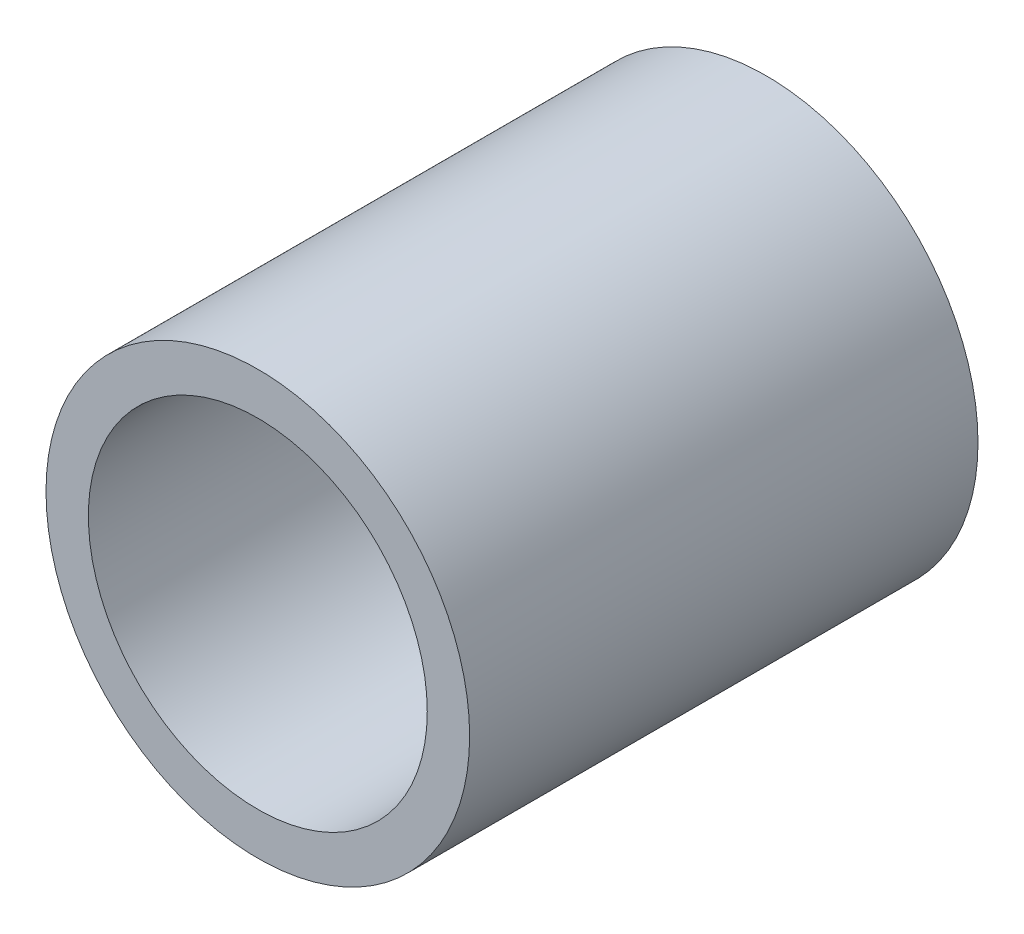
ISO-10303-21;
HEADER;
FILE_DESCRIPTION(('STEP AP214'),'2;1');
FILE_NAME('part.step','',(''),(''),'','','');
FILE_SCHEMA(('AUTOMOTIVE_DESIGN { 1 0 10303 214 1 1 1 1 }'));
ENDSEC;
DATA;
#1=APPLICATION_CONTEXT('core data for automotive mechanical design processes');
#2=APPLICATION_PROTOCOL_DEFINITION('international standard','automotive_design',2000,#1);
#3=PRODUCT_CONTEXT('',#1,'mechanical');
#4=PRODUCT('Part','Part','',(#3));
#5=PRODUCT_RELATED_PRODUCT_CATEGORY('part','',(#4));
#6=PRODUCT_DEFINITION_FORMATION('','',#4);
#7=PRODUCT_DEFINITION_CONTEXT('part definition',#1,'design');
#8=PRODUCT_DEFINITION('design','',#6,#7);
#9=PRODUCT_DEFINITION_SHAPE('','',#8);
#10=(LENGTH_UNIT() NAMED_UNIT(*) SI_UNIT(.MILLI.,.METRE.));
#11=(NAMED_UNIT(*) PLANE_ANGLE_UNIT() SI_UNIT($,.RADIAN.));
#12=(NAMED_UNIT(*) SI_UNIT($,.STERADIAN.) SOLID_ANGLE_UNIT());
#13=UNCERTAINTY_MEASURE_WITH_UNIT(LENGTH_MEASURE(1.E-05),#10,'distance_accuracy_value','');
#14=(GEOMETRIC_REPRESENTATION_CONTEXT(3) GLOBAL_UNCERTAINTY_ASSIGNED_CONTEXT((#13)) GLOBAL_UNIT_ASSIGNED_CONTEXT((#10,
#11,#12)) REPRESENTATION_CONTEXT('',''));
#15=CARTESIAN_POINT('',(0.,0.,0.));
#16=DIRECTION('',(0.,0.,1.));
#17=DIRECTION('',(1.,0.,0.));
#18=AXIS2_PLACEMENT_3D('',#15,#16,#17);
#19=CARTESIAN_POINT('',(0.,0.,0.));
#20=DIRECTION('',(0.,0.,-1.));
#21=DIRECTION('',(-1.,0.,0.));
#22=AXIS2_PLACEMENT_3D('',#19,#20,#21);
#23=PLANE('',#22);
#24=CARTESIAN_POINT('',(0.,0.,0.));
#25=DIRECTION('',(0.,0.,1.));
#26=DIRECTION('',(1.,0.,0.));
#27=AXIS2_PLACEMENT_3D('',#24,#25,#26);
#28=CIRCLE('',#27,6.35);
#29=CARTESIAN_POINT('',(6.35,0.,0.));
#30=VERTEX_POINT('',#29);
#31=EDGE_CURVE('E46',#30,#30,#28,.T.);
#32=ORIENTED_EDGE('',*,*,#31,.F.);
#33=EDGE_LOOP('',(#32));
#34=FACE_BOUND('',#33,.T.);
#35=CARTESIAN_POINT('',(0.,0.,0.));
#36=DIRECTION('',(0.,0.,1.));
#37=DIRECTION('',(1.,0.,0.));
#38=AXIS2_PLACEMENT_3D('',#35,#36,#37);
#39=CIRCLE('',#38,7.9375);
#40=CARTESIAN_POINT('',(7.9375,0.,0.));
#41=VERTEX_POINT('',#40);
#42=EDGE_CURVE('E10',#41,#41,#39,.T.);
#43=ORIENTED_EDGE('',*,*,#42,.T.);
#44=EDGE_LOOP('',(#43));
#45=FACE_BOUND('',#44,.T.);
#46=ADVANCED_FACE('F32',(#34,#45),#23,.F.);
#47=CARTESIAN_POINT('',(0.,0.,-2.52020626589911E-11));
#48=DIRECTION('',(0.,0.,1.));
#49=DIRECTION('',(1.,0.,0.));
#50=AXIS2_PLACEMENT_3D('',#47,#48,#49);
#51=CYLINDRICAL_SURFACE('',#50,7.9375);
#52=ORIENTED_EDGE('',*,*,#42,.F.);
#53=EDGE_LOOP('',(#52));
#54=FACE_BOUND('',#53,.T.);
#55=CARTESIAN_POINT('',(0.,0.,-19.05));
#56=DIRECTION('',(0.,0.,1.));
#57=DIRECTION('',(1.,0.,0.));
#58=AXIS2_PLACEMENT_3D('',#55,#56,#57);
#59=CIRCLE('',#58,7.9375);
#60=CARTESIAN_POINT('',(7.9375,0.,-19.05));
#61=VERTEX_POINT('',#60);
#62=EDGE_CURVE('E38',#61,#61,#59,.T.);
#63=ORIENTED_EDGE('',*,*,#62,.T.);
#64=EDGE_LOOP('',(#63));
#65=FACE_BOUND('',#64,.T.);
#66=ADVANCED_FACE('F56',(#54,#65),#51,.T.);
#67=CARTESIAN_POINT('',(0.,7.9375,-19.05));
#68=DIRECTION('',(0.,0.,1.));
#69=DIRECTION('',(1.,0.,0.));
#70=AXIS2_PLACEMENT_3D('',#67,#68,#69);
#71=PLANE('',#70);
#72=CARTESIAN_POINT('',(0.,0.,-19.05));
#73=DIRECTION('',(0.,0.,1.));
#74=DIRECTION('',(1.,0.,0.));
#75=AXIS2_PLACEMENT_3D('',#72,#73,#74);
#76=CIRCLE('',#75,6.35);
#77=CARTESIAN_POINT('',(6.35,0.,-19.05));
#78=VERTEX_POINT('',#77);
#79=EDGE_CURVE('E42',#78,#78,#76,.F.);
#80=ORIENTED_EDGE('',*,*,#79,.F.);
#81=EDGE_LOOP('',(#80));
#82=FACE_BOUND('',#81,.T.);
#83=ORIENTED_EDGE('',*,*,#62,.F.);
#84=EDGE_LOOP('',(#83));
#85=FACE_BOUND('',#84,.T.);
#86=ADVANCED_FACE('F60',(#82,#85),#71,.F.);
#87=CARTESIAN_POINT('',(0.,0.,-19.051));
#88=DIRECTION('',(0.,0.,1.));
#89=DIRECTION('',(1.,0.,0.));
#90=AXIS2_PLACEMENT_3D('',#87,#88,#89);
#91=CYLINDRICAL_SURFACE('',#90,6.35);
#92=ORIENTED_EDGE('',*,*,#31,.T.);
#93=EDGE_LOOP('',(#92));
#94=FACE_BOUND('',#93,.T.);
#95=ORIENTED_EDGE('',*,*,#79,.T.);
#96=EDGE_LOOP('',(#95));
#97=FACE_BOUND('',#96,.T.);
#98=ADVANCED_FACE('F52',(#94,#97),#91,.F.);
#99=CLOSED_SHELL('',(#46,#66,#86,#98));
#100=MANIFOLD_SOLID_BREP('B2',#99);
#101=ADVANCED_BREP_SHAPE_REPRESENTATION('',(#18,#100),#14);
#102=SHAPE_DEFINITION_REPRESENTATION(#9,#101);
ENDSEC;
END-ISO-10303-21;
